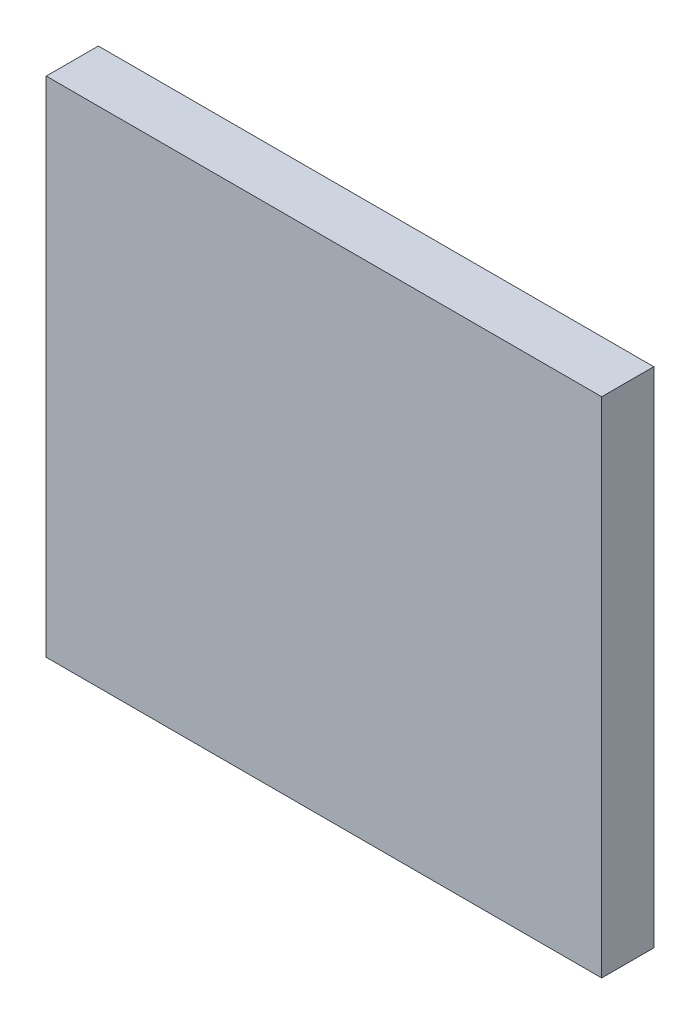
ISO-10303-21;
HEADER;
FILE_DESCRIPTION(('STEP AP214'),'2;1');
FILE_NAME('part.step','',(''),(''),'','','');
FILE_SCHEMA(('AUTOMOTIVE_DESIGN { 1 0 10303 214 1 1 1 1 }'));
ENDSEC;
DATA;
#1=APPLICATION_CONTEXT('core data for automotive mechanical design processes');
#2=APPLICATION_PROTOCOL_DEFINITION('international standard','automotive_design',2000,#1);
#3=PRODUCT_CONTEXT('',#1,'mechanical');
#4=PRODUCT('Part','Part','',(#3));
#5=PRODUCT_RELATED_PRODUCT_CATEGORY('part','',(#4));
#6=PRODUCT_DEFINITION_FORMATION('','',#4);
#7=PRODUCT_DEFINITION_CONTEXT('part definition',#1,'design');
#8=PRODUCT_DEFINITION('design','',#6,#7);
#9=PRODUCT_DEFINITION_SHAPE('','',#8);
#10=(LENGTH_UNIT() NAMED_UNIT(*) SI_UNIT(.MILLI.,.METRE.));
#11=(NAMED_UNIT(*) PLANE_ANGLE_UNIT() SI_UNIT($,.RADIAN.));
#12=(NAMED_UNIT(*) SI_UNIT($,.STERADIAN.) SOLID_ANGLE_UNIT());
#13=UNCERTAINTY_MEASURE_WITH_UNIT(LENGTH_MEASURE(1.E-05),#10,'distance_accuracy_value','');
#14=(GEOMETRIC_REPRESENTATION_CONTEXT(3) GLOBAL_UNCERTAINTY_ASSIGNED_CONTEXT((#13)) GLOBAL_UNIT_ASSIGNED_CONTEXT((#10,
#11,#12)) REPRESENTATION_CONTEXT('',''));
#15=CARTESIAN_POINT('',(0.,0.,0.));
#16=DIRECTION('',(0.,0.,1.));
#17=DIRECTION('',(1.,0.,0.));
#18=AXIS2_PLACEMENT_3D('',#15,#16,#17);
#19=CARTESIAN_POINT('',(0.,0.,4.7625));
#20=DIRECTION('',(1.,0.,0.));
#21=DIRECTION('',(0.,0.,-1.));
#22=AXIS2_PLACEMENT_3D('',#19,#20,#21);
#23=PLANE('',#22);
#24=DIRECTION('',(0.,-1.,0.));
#25=VECTOR('',#24,1.);
#26=CARTESIAN_POINT('',(0.,0.,0.));
#27=LINE('',#26,#25);
#28=CARTESIAN_POINT('',(0.,46.0375,0.));
#29=VERTEX_POINT('',#28);
#30=CARTESIAN_POINT('',(0.,0.,0.));
#31=VERTEX_POINT('',#30);
#32=EDGE_CURVE('E97',#29,#31,#27,.T.);
#33=ORIENTED_EDGE('',*,*,#32,.T.);
#34=DIRECTION('',(0.,0.,-1.));
#35=VECTOR('',#34,1.);
#36=CARTESIAN_POINT('',(0.,0.,4.7625));
#37=LINE('',#36,#35);
#38=CARTESIAN_POINT('',(0.,0.,4.7625));
#39=VERTEX_POINT('',#38);
#40=EDGE_CURVE('E11',#39,#31,#37,.T.);
#41=ORIENTED_EDGE('',*,*,#40,.F.);
#42=DIRECTION('',(0.,-1.,0.));
#43=VECTOR('',#42,1.);
#44=CARTESIAN_POINT('',(0.,0.,4.7625));
#45=LINE('',#44,#43);
#46=CARTESIAN_POINT('',(0.,46.0375,4.7625));
#47=VERTEX_POINT('',#46);
#48=EDGE_CURVE('E85',#47,#39,#45,.T.);
#49=ORIENTED_EDGE('',*,*,#48,.F.);
#50=DIRECTION('',(0.,0.,-1.));
#51=VECTOR('',#50,1.);
#52=CARTESIAN_POINT('',(0.,46.0375,4.7625));
#53=LINE('',#52,#51);
#54=EDGE_CURVE('E93',#47,#29,#53,.T.);
#55=ORIENTED_EDGE('',*,*,#54,.T.);
#56=EDGE_LOOP('',(#33,#41,#49,#55));
#57=FACE_BOUND('',#56,.T.);
#58=ADVANCED_FACE('F34',(#57),#23,.F.);
#59=CARTESIAN_POINT('',(0.,0.,4.7625));
#60=DIRECTION('',(0.,1.,0.));
#61=DIRECTION('',(0.,0.,1.));
#62=AXIS2_PLACEMENT_3D('',#59,#60,#61);
#63=PLANE('',#62);
#64=DIRECTION('',(1.,0.,0.));
#65=VECTOR('',#64,1.);
#66=CARTESIAN_POINT('',(0.,0.,0.));
#67=LINE('',#66,#65);
#68=CARTESIAN_POINT('',(50.8,0.,0.));
#69=VERTEX_POINT('',#68);
#70=EDGE_CURVE('E89',#31,#69,#67,.T.);
#71=ORIENTED_EDGE('',*,*,#70,.T.);
#72=DIRECTION('',(0.,0.,-1.));
#73=VECTOR('',#72,1.);
#74=CARTESIAN_POINT('',(50.8,0.,4.7625));
#75=LINE('',#74,#73);
#76=CARTESIAN_POINT('',(50.8,0.,4.7625));
#77=VERTEX_POINT('',#76);
#78=EDGE_CURVE('E42',#77,#69,#75,.T.);
#79=ORIENTED_EDGE('',*,*,#78,.F.);
#80=DIRECTION('',(1.,0.,0.));
#81=VECTOR('',#80,1.);
#82=CARTESIAN_POINT('',(0.,0.,4.7625));
#83=LINE('',#82,#81);
#84=EDGE_CURVE('E80',#39,#77,#83,.T.);
#85=ORIENTED_EDGE('',*,*,#84,.F.);
#86=ORIENTED_EDGE('',*,*,#40,.T.);
#87=EDGE_LOOP('',(#71,#79,#85,#86));
#88=FACE_BOUND('',#87,.T.);
#89=ADVANCED_FACE('F88',(#88),#63,.F.);
#90=CARTESIAN_POINT('',(50.8,0.,4.7625));
#91=DIRECTION('',(-1.,0.,0.));
#92=DIRECTION('',(0.,0.,1.));
#93=AXIS2_PLACEMENT_3D('',#90,#91,#92);
#94=PLANE('',#93);
#95=DIRECTION('',(0.,1.,0.));
#96=VECTOR('',#95,1.);
#97=CARTESIAN_POINT('',(50.8,0.,0.));
#98=LINE('',#97,#96);
#99=CARTESIAN_POINT('',(50.8,46.0375,0.));
#100=VERTEX_POINT('',#99);
#101=EDGE_CURVE('E67',#69,#100,#98,.T.);
#102=ORIENTED_EDGE('',*,*,#101,.T.);
#103=DIRECTION('',(0.,0.,-1.));
#104=VECTOR('',#103,1.);
#105=CARTESIAN_POINT('',(50.8,46.0375,4.7625));
#106=LINE('',#105,#104);
#107=CARTESIAN_POINT('',(50.8,46.0375,4.7625));
#108=VERTEX_POINT('',#107);
#109=EDGE_CURVE('E90',#108,#100,#106,.T.);
#110=ORIENTED_EDGE('',*,*,#109,.F.);
#111=DIRECTION('',(0.,1.,0.));
#112=VECTOR('',#111,1.);
#113=CARTESIAN_POINT('',(50.8,0.,4.7625));
#114=LINE('',#113,#112);
#115=EDGE_CURVE('E83',#77,#108,#114,.T.);
#116=ORIENTED_EDGE('',*,*,#115,.F.);
#117=ORIENTED_EDGE('',*,*,#78,.T.);
#118=EDGE_LOOP('',(#102,#110,#116,#117));
#119=FACE_BOUND('',#118,.T.);
#120=ADVANCED_FACE('F91',(#119),#94,.F.);
#121=CARTESIAN_POINT('',(0.,46.0375,4.7625));
#122=DIRECTION('',(0.,-1.,0.));
#123=DIRECTION('',(0.,0.,-1.));
#124=AXIS2_PLACEMENT_3D('',#121,#122,#123);
#125=PLANE('',#124);
#126=DIRECTION('',(-1.,0.,0.));
#127=VECTOR('',#126,1.);
#128=CARTESIAN_POINT('',(0.,46.0375,0.));
#129=LINE('',#128,#127);
#130=EDGE_CURVE('E73',#100,#29,#129,.T.);
#131=ORIENTED_EDGE('',*,*,#130,.T.);
#132=ORIENTED_EDGE('',*,*,#54,.F.);
#133=DIRECTION('',(-1.,0.,0.));
#134=VECTOR('',#133,1.);
#135=CARTESIAN_POINT('',(0.,46.0375,4.7625));
#136=LINE('',#135,#134);
#137=EDGE_CURVE('E50',#108,#47,#136,.T.);
#138=ORIENTED_EDGE('',*,*,#137,.F.);
#139=ORIENTED_EDGE('',*,*,#109,.T.);
#140=EDGE_LOOP('',(#131,#132,#138,#139));
#141=FACE_BOUND('',#140,.T.);
#142=ADVANCED_FACE('F104',(#141),#125,.F.);
#143=CARTESIAN_POINT('',(0.,0.,4.7625));
#144=DIRECTION('',(0.,0.,-1.));
#145=DIRECTION('',(-1.,0.,0.));
#146=AXIS2_PLACEMENT_3D('',#143,#144,#145);
#147=PLANE('',#146);
#148=ORIENTED_EDGE('',*,*,#48,.T.);
#149=ORIENTED_EDGE('',*,*,#84,.T.);
#150=ORIENTED_EDGE('',*,*,#115,.T.);
#151=ORIENTED_EDGE('',*,*,#137,.T.);
#152=EDGE_LOOP('',(#148,#149,#150,#151));
#153=FACE_BOUND('',#152,.T.);
#154=ADVANCED_FACE('F81',(#153),#147,.F.);
#155=CARTESIAN_POINT('',(0.,0.,0.));
#156=DIRECTION('',(0.,0.,-1.));
#157=DIRECTION('',(-1.,0.,0.));
#158=AXIS2_PLACEMENT_3D('',#155,#156,#157);
#159=PLANE('',#158);
#160=ORIENTED_EDGE('',*,*,#32,.F.);
#161=ORIENTED_EDGE('',*,*,#130,.F.);
#162=ORIENTED_EDGE('',*,*,#101,.F.);
#163=ORIENTED_EDGE('',*,*,#70,.F.);
#164=EDGE_LOOP('',(#160,#161,#162,#163));
#165=FACE_BOUND('',#164,.T.);
#166=ADVANCED_FACE('F107',(#165),#159,.T.);
#167=CLOSED_SHELL('',(#58,#89,#120,#142,#154,#166));
#168=MANIFOLD_SOLID_BREP('B2',#167);
#169=ADVANCED_BREP_SHAPE_REPRESENTATION('',(#18,#168),#14);
#170=SHAPE_DEFINITION_REPRESENTATION(#9,#169);
ENDSEC;
END-ISO-10303-21;
